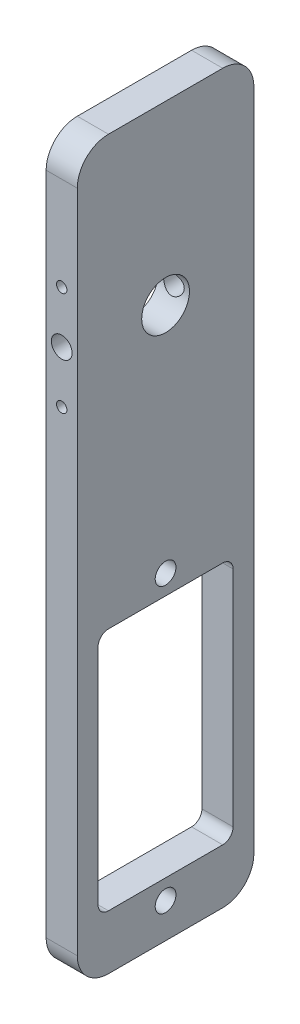
ISO-10303-21;
HEADER;
FILE_DESCRIPTION(('STEP AP214'),'2;1');
FILE_NAME('part.step','',(''),(''),'','','');
FILE_SCHEMA(('AUTOMOTIVE_DESIGN { 1 0 10303 214 1 1 1 1 }'));
ENDSEC;
DATA;
#1=APPLICATION_CONTEXT('core data for automotive mechanical design processes');
#2=APPLICATION_PROTOCOL_DEFINITION('international standard','automotive_design',2000,#1);
#3=PRODUCT_CONTEXT('',#1,'mechanical');
#4=PRODUCT('Part','Part','',(#3));
#5=PRODUCT_RELATED_PRODUCT_CATEGORY('part','',(#4));
#6=PRODUCT_DEFINITION_FORMATION('','',#4);
#7=PRODUCT_DEFINITION_CONTEXT('part definition',#1,'design');
#8=PRODUCT_DEFINITION('design','',#6,#7);
#9=PRODUCT_DEFINITION_SHAPE('','',#8);
#10=(LENGTH_UNIT() NAMED_UNIT(*) SI_UNIT(.MILLI.,.METRE.));
#11=(NAMED_UNIT(*) PLANE_ANGLE_UNIT() SI_UNIT($,.RADIAN.));
#12=(NAMED_UNIT(*) SI_UNIT($,.STERADIAN.) SOLID_ANGLE_UNIT());
#13=UNCERTAINTY_MEASURE_WITH_UNIT(LENGTH_MEASURE(1.E-05),#10,'distance_accuracy_value','');
#14=(GEOMETRIC_REPRESENTATION_CONTEXT(3) GLOBAL_UNCERTAINTY_ASSIGNED_CONTEXT((#13)) GLOBAL_UNIT_ASSIGNED_CONTEXT((#10,
#11,#12)) REPRESENTATION_CONTEXT('',''));
#15=CARTESIAN_POINT('',(0.,0.,0.));
#16=DIRECTION('',(0.,0.,1.));
#17=DIRECTION('',(1.,0.,0.));
#18=AXIS2_PLACEMENT_3D('',#15,#16,#17);
#19=CARTESIAN_POINT('',(3.,67.,5.5));
#20=DIRECTION('',(-1.,0.,0.));
#21=DIRECTION('',(0.,0.,1.));
#22=AXIS2_PLACEMENT_3D('',#19,#20,#21);
#23=PLANE('',#22);
#24=CARTESIAN_POINT('',(3.,6.25,5.5));
#25=DIRECTION('',(1.,0.,0.));
#26=DIRECTION('',(0.,0.,-1.));
#27=AXIS2_PLACEMENT_3D('',#24,#25,#26);
#28=CIRCLE('',#27,1.);
#29=CARTESIAN_POINT('',(3.,6.25,6.5));
#30=VERTEX_POINT('',#29);
#31=CARTESIAN_POINT('',(3.,5.25,5.5));
#32=VERTEX_POINT('',#31);
#33=EDGE_CURVE('E154',#30,#32,#28,.T.);
#34=ORIENTED_EDGE('',*,*,#33,.F.);
#35=DIRECTION('',(0.,-1.,0.));
#36=VECTOR('',#35,1.);
#37=CARTESIAN_POINT('',(3.,27.75,6.5));
#38=LINE('',#37,#36);
#39=CARTESIAN_POINT('',(3.,27.75,6.5));
#40=VERTEX_POINT('',#39);
#41=EDGE_CURVE('E189',#40,#30,#38,.T.);
#42=ORIENTED_EDGE('',*,*,#41,.F.);
#43=CARTESIAN_POINT('',(3.,27.75,5.5));
#44=DIRECTION('',(1.,0.,0.));
#45=DIRECTION('',(0.,0.,-1.));
#46=AXIS2_PLACEMENT_3D('',#43,#44,#45);
#47=CIRCLE('',#46,1.);
#48=CARTESIAN_POINT('',(3.,28.75,5.5));
#49=VERTEX_POINT('',#48);
#50=EDGE_CURVE('E187',#49,#40,#47,.T.);
#51=ORIENTED_EDGE('',*,*,#50,.F.);
#52=DIRECTION('',(0.,0.,1.));
#53=VECTOR('',#52,1.);
#54=CARTESIAN_POINT('',(3.,28.75,5.5));
#55=LINE('',#54,#53);
#56=CARTESIAN_POINT('',(3.,28.75,-5.5));
#57=VERTEX_POINT('',#56);
#58=EDGE_CURVE('E185',#57,#49,#55,.T.);
#59=ORIENTED_EDGE('',*,*,#58,.F.);
#60=CARTESIAN_POINT('',(3.,27.75,-5.5));
#61=DIRECTION('',(1.,0.,0.));
#62=DIRECTION('',(0.,0.,1.));
#63=AXIS2_PLACEMENT_3D('',#60,#61,#62);
#64=CIRCLE('',#63,1.);
#65=CARTESIAN_POINT('',(3.,27.75,-6.5));
#66=VERTEX_POINT('',#65);
#67=EDGE_CURVE('E183',#66,#57,#64,.T.);
#68=ORIENTED_EDGE('',*,*,#67,.F.);
#69=DIRECTION('',(0.,1.,0.));
#70=VECTOR('',#69,1.);
#71=CARTESIAN_POINT('',(3.,27.75,-6.5));
#72=LINE('',#71,#70);
#73=CARTESIAN_POINT('',(3.,6.25,-6.5));
#74=VERTEX_POINT('',#73);
#75=EDGE_CURVE('E178',#74,#66,#72,.T.);
#76=ORIENTED_EDGE('',*,*,#75,.F.);
#77=CARTESIAN_POINT('',(3.,6.25,-5.5));
#78=DIRECTION('',(1.,0.,0.));
#79=DIRECTION('',(0.,0.,-1.));
#80=AXIS2_PLACEMENT_3D('',#77,#78,#79);
#81=CIRCLE('',#80,1.);
#82=CARTESIAN_POINT('',(3.,5.25,-5.5));
#83=VERTEX_POINT('',#82);
#84=EDGE_CURVE('E176',#83,#74,#81,.T.);
#85=ORIENTED_EDGE('',*,*,#84,.F.);
#86=DIRECTION('',(0.,0.,-1.));
#87=VECTOR('',#86,1.);
#88=CARTESIAN_POINT('',(3.,5.25,5.5));
#89=LINE('',#88,#87);
#90=EDGE_CURVE('E162',#32,#83,#89,.T.);
#91=ORIENTED_EDGE('',*,*,#90,.F.);
#92=EDGE_LOOP('',(#34,#42,#51,#59,#68,#76,#85,#91));
#93=FACE_BOUND('',#92,.T.);
#94=CARTESIAN_POINT('',(3.,3.35,0.));
#95=DIRECTION('',(1.,0.,0.));
#96=DIRECTION('',(0.,0.,-1.));
#97=AXIS2_PLACEMENT_3D('',#94,#95,#96);
#98=CIRCLE('',#97,1.);
#99=CARTESIAN_POINT('',(3.,3.35,-1.));
#100=VERTEX_POINT('',#99);
#101=EDGE_CURVE('E228',#100,#100,#98,.T.);
#102=ORIENTED_EDGE('',*,*,#101,.F.);
#103=EDGE_LOOP('',(#102));
#104=FACE_BOUND('',#103,.T.);
#105=CARTESIAN_POINT('',(3.,67.,5.5));
#106=DIRECTION('',(1.,0.,0.));
#107=DIRECTION('',(0.,0.,1.));
#108=AXIS2_PLACEMENT_3D('',#105,#106,#107);
#109=CIRCLE('',#108,3.);
#110=CARTESIAN_POINT('',(3.,70.,5.5));
#111=VERTEX_POINT('',#110);
#112=CARTESIAN_POINT('',(3.,67.,8.5));
#113=VERTEX_POINT('',#112);
#114=EDGE_CURVE('E234',#111,#113,#109,.T.);
#115=ORIENTED_EDGE('',*,*,#114,.T.);
#116=DIRECTION('',(0.,-1.,0.));
#117=VECTOR('',#116,1.);
#118=CARTESIAN_POINT('',(3.,3.00000000000002,8.5));
#119=LINE('',#118,#117);
#120=CARTESIAN_POINT('',(3.,3.00000000000002,8.5));
#121=VERTEX_POINT('',#120);
#122=EDGE_CURVE('E237',#113,#121,#119,.T.);
#123=ORIENTED_EDGE('',*,*,#122,.T.);
#124=CARTESIAN_POINT('',(3.,3.,5.5));
#125=DIRECTION('',(1.,0.,0.));
#126=DIRECTION('',(0.,0.,-1.));
#127=AXIS2_PLACEMENT_3D('',#124,#125,#126);
#128=CIRCLE('',#127,3.);
#129=CARTESIAN_POINT('',(3.,0.,5.49999999999998));
#130=VERTEX_POINT('',#129);
#131=EDGE_CURVE('E240',#121,#130,#128,.T.);
#132=ORIENTED_EDGE('',*,*,#131,.T.);
#133=DIRECTION('',(0.,0.,-1.));
#134=VECTOR('',#133,1.);
#135=CARTESIAN_POINT('',(3.,0.,5.49999999999998));
#136=LINE('',#135,#134);
#137=CARTESIAN_POINT('',(3.,0.,-5.49999999999998));
#138=VERTEX_POINT('',#137);
#139=EDGE_CURVE('E242',#130,#138,#136,.T.);
#140=ORIENTED_EDGE('',*,*,#139,.T.);
#141=CARTESIAN_POINT('',(3.,3.,-5.5));
#142=DIRECTION('',(1.,0.,0.));
#143=DIRECTION('',(0.,0.,-1.));
#144=AXIS2_PLACEMENT_3D('',#141,#142,#143);
#145=CIRCLE('',#144,3.);
#146=CARTESIAN_POINT('',(3.,3.00000000000002,-8.5));
#147=VERTEX_POINT('',#146);
#148=EDGE_CURVE('E244',#138,#147,#145,.T.);
#149=ORIENTED_EDGE('',*,*,#148,.T.);
#150=DIRECTION('',(0.,1.,0.));
#151=VECTOR('',#150,1.);
#152=CARTESIAN_POINT('',(3.,3.00000000000002,-8.5));
#153=LINE('',#152,#151);
#154=CARTESIAN_POINT('',(3.,67.,-8.5));
#155=VERTEX_POINT('',#154);
#156=EDGE_CURVE('E246',#147,#155,#153,.T.);
#157=ORIENTED_EDGE('',*,*,#156,.T.);
#158=CARTESIAN_POINT('',(3.,67.,-5.5));
#159=DIRECTION('',(1.,0.,0.));
#160=DIRECTION('',(0.,0.,1.));
#161=AXIS2_PLACEMENT_3D('',#158,#159,#160);
#162=CIRCLE('',#161,3.);
#163=CARTESIAN_POINT('',(3.,70.,-5.5));
#164=VERTEX_POINT('',#163);
#165=EDGE_CURVE('E248',#155,#164,#162,.T.);
#166=ORIENTED_EDGE('',*,*,#165,.T.);
#167=DIRECTION('',(0.,0.,1.));
#168=VECTOR('',#167,1.);
#169=CARTESIAN_POINT('',(3.,70.,5.5));
#170=LINE('',#169,#168);
#171=EDGE_CURVE('E250',#164,#111,#170,.T.);
#172=ORIENTED_EDGE('',*,*,#171,.T.);
#173=EDGE_LOOP('',(#115,#123,#132,#140,#149,#157,#166,#172));
#174=FACE_BOUND('',#173,.T.);
#175=CARTESIAN_POINT('',(3.,30.65,0.));
#176=DIRECTION('',(1.,0.,0.));
#177=DIRECTION('',(0.,0.,1.));
#178=AXIS2_PLACEMENT_3D('',#175,#176,#177);
#179=CIRCLE('',#178,1.);
#180=CARTESIAN_POINT('',(3.,30.65,1.));
#181=VERTEX_POINT('',#180);
#182=EDGE_CURVE('E222',#181,#181,#179,.T.);
#183=ORIENTED_EDGE('',*,*,#182,.F.);
#184=EDGE_LOOP('',(#183));
#185=FACE_BOUND('',#184,.T.);
#186=CARTESIAN_POINT('',(3.,53.,0.));
#187=DIRECTION('',(1.,0.,0.));
#188=DIRECTION('',(0.,0.,1.));
#189=AXIS2_PLACEMENT_3D('',#186,#187,#188);
#190=CIRCLE('',#189,2.3);
#191=CARTESIAN_POINT('',(3.,53.,2.3));
#192=VERTEX_POINT('',#191);
#193=EDGE_CURVE('E192',#192,#192,#190,.T.);
#194=ORIENTED_EDGE('',*,*,#193,.F.);
#195=EDGE_LOOP('',(#194));
#196=FACE_BOUND('',#195,.T.);
#197=ADVANCED_FACE('F35',(#93,#104,#174,#185,#196),#23,.F.);
#198=CARTESIAN_POINT('',(0.,67.,5.5));
#199=DIRECTION('',(-1.,0.,0.));
#200=DIRECTION('',(0.,0.,1.));
#201=AXIS2_PLACEMENT_3D('',#198,#199,#200);
#202=PLANE('',#201);
#203=DIRECTION('',(0.,-1.,0.));
#204=VECTOR('',#203,1.);
#205=CARTESIAN_POINT('',(0.,27.75,6.5));
#206=LINE('',#205,#204);
#207=CARTESIAN_POINT('',(0.,27.75,6.5));
#208=VERTEX_POINT('',#207);
#209=CARTESIAN_POINT('',(0.,6.25000000000001,6.5));
#210=VERTEX_POINT('',#209);
#211=EDGE_CURVE('E163',#208,#210,#206,.T.);
#212=ORIENTED_EDGE('',*,*,#211,.T.);
#213=CARTESIAN_POINT('',(0.,6.25,5.5));
#214=DIRECTION('',(1.,0.,0.));
#215=DIRECTION('',(0.,0.,-1.));
#216=AXIS2_PLACEMENT_3D('',#213,#214,#215);
#217=CIRCLE('',#216,1.);
#218=CARTESIAN_POINT('',(0.,5.25,5.5));
#219=VERTEX_POINT('',#218);
#220=EDGE_CURVE('E64',#210,#219,#217,.T.);
#221=ORIENTED_EDGE('',*,*,#220,.T.);
#222=DIRECTION('',(0.,0.,-1.));
#223=VECTOR('',#222,1.);
#224=CARTESIAN_POINT('',(0.,5.25,5.5));
#225=LINE('',#224,#223);
#226=CARTESIAN_POINT('',(0.,5.25,-5.5));
#227=VERTEX_POINT('',#226);
#228=EDGE_CURVE('E169',#219,#227,#225,.T.);
#229=ORIENTED_EDGE('',*,*,#228,.T.);
#230=CARTESIAN_POINT('',(0.,6.25,-5.5));
#231=DIRECTION('',(1.,0.,0.));
#232=DIRECTION('',(0.,0.,-1.));
#233=AXIS2_PLACEMENT_3D('',#230,#231,#232);
#234=CIRCLE('',#233,1.);
#235=CARTESIAN_POINT('',(0.,6.25,-6.5));
#236=VERTEX_POINT('',#235);
#237=EDGE_CURVE('E194',#227,#236,#234,.T.);
#238=ORIENTED_EDGE('',*,*,#237,.T.);
#239=DIRECTION('',(0.,1.,0.));
#240=VECTOR('',#239,1.);
#241=CARTESIAN_POINT('',(0.,27.75,-6.5));
#242=LINE('',#241,#240);
#243=CARTESIAN_POINT('',(0.,27.75,-6.5));
#244=VERTEX_POINT('',#243);
#245=EDGE_CURVE('E197',#236,#244,#242,.T.);
#246=ORIENTED_EDGE('',*,*,#245,.T.);
#247=CARTESIAN_POINT('',(0.,27.75,-5.5));
#248=DIRECTION('',(1.,0.,0.));
#249=DIRECTION('',(0.,0.,1.));
#250=AXIS2_PLACEMENT_3D('',#247,#248,#249);
#251=CIRCLE('',#250,1.);
#252=CARTESIAN_POINT('',(0.,28.75,-5.5));
#253=VERTEX_POINT('',#252);
#254=EDGE_CURVE('E200',#244,#253,#251,.T.);
#255=ORIENTED_EDGE('',*,*,#254,.T.);
#256=DIRECTION('',(0.,0.,1.));
#257=VECTOR('',#256,1.);
#258=CARTESIAN_POINT('',(0.,28.75,5.5));
#259=LINE('',#258,#257);
#260=CARTESIAN_POINT('',(0.,28.75,5.5));
#261=VERTEX_POINT('',#260);
#262=EDGE_CURVE('E203',#253,#261,#259,.T.);
#263=ORIENTED_EDGE('',*,*,#262,.T.);
#264=CARTESIAN_POINT('',(0.,27.75,5.5));
#265=DIRECTION('',(1.,0.,0.));
#266=DIRECTION('',(0.,0.,-1.));
#267=AXIS2_PLACEMENT_3D('',#264,#265,#266);
#268=CIRCLE('',#267,1.);
#269=EDGE_CURVE('E206',#261,#208,#268,.T.);
#270=ORIENTED_EDGE('',*,*,#269,.T.);
#271=EDGE_LOOP('',(#212,#221,#229,#238,#246,#255,#263,#270));
#272=FACE_BOUND('',#271,.T.);
#273=CARTESIAN_POINT('',(0.,3.35,0.));
#274=DIRECTION('',(1.,0.,0.));
#275=DIRECTION('',(0.,0.,-1.));
#276=AXIS2_PLACEMENT_3D('',#273,#274,#275);
#277=CIRCLE('',#276,1.);
#278=CARTESIAN_POINT('',(0.,3.35,-1.));
#279=VERTEX_POINT('',#278);
#280=EDGE_CURVE('E225',#279,#279,#277,.T.);
#281=ORIENTED_EDGE('',*,*,#280,.T.);
#282=EDGE_LOOP('',(#281));
#283=FACE_BOUND('',#282,.T.);
#284=CARTESIAN_POINT('',(0.,67.,5.5));
#285=DIRECTION('',(1.,0.,0.));
#286=DIRECTION('',(0.,0.,1.));
#287=AXIS2_PLACEMENT_3D('',#284,#285,#286);
#288=CIRCLE('',#287,3.);
#289=CARTESIAN_POINT('',(0.,70.,5.5));
#290=VERTEX_POINT('',#289);
#291=CARTESIAN_POINT('',(0.,67.,8.5));
#292=VERTEX_POINT('',#291);
#293=EDGE_CURVE('E231',#290,#292,#288,.T.);
#294=ORIENTED_EDGE('',*,*,#293,.F.);
#295=DIRECTION('',(0.,0.,1.));
#296=VECTOR('',#295,1.);
#297=CARTESIAN_POINT('',(0.,70.,5.5));
#298=LINE('',#297,#296);
#299=CARTESIAN_POINT('',(0.,70.,-5.5));
#300=VERTEX_POINT('',#299);
#301=EDGE_CURVE('E238',#300,#290,#298,.T.);
#302=ORIENTED_EDGE('',*,*,#301,.F.);
#303=CARTESIAN_POINT('',(0.,67.,-5.5));
#304=DIRECTION('',(1.,0.,0.));
#305=DIRECTION('',(0.,0.,1.));
#306=AXIS2_PLACEMENT_3D('',#303,#304,#305);
#307=CIRCLE('',#306,3.);
#308=CARTESIAN_POINT('',(0.,67.,-8.5));
#309=VERTEX_POINT('',#308);
#310=EDGE_CURVE('E265',#309,#300,#307,.T.);
#311=ORIENTED_EDGE('',*,*,#310,.F.);
#312=DIRECTION('',(0.,1.,0.));
#313=VECTOR('',#312,1.);
#314=CARTESIAN_POINT('',(0.,3.00000000000002,-8.5));
#315=LINE('',#314,#313);
#316=CARTESIAN_POINT('',(0.,3.00000000000002,-8.5));
#317=VERTEX_POINT('',#316);
#318=EDGE_CURVE('E263',#317,#309,#315,.T.);
#319=ORIENTED_EDGE('',*,*,#318,.F.);
#320=CARTESIAN_POINT('',(0.,3.,-5.5));
#321=DIRECTION('',(1.,0.,0.));
#322=DIRECTION('',(0.,0.,-1.));
#323=AXIS2_PLACEMENT_3D('',#320,#321,#322);
#324=CIRCLE('',#323,3.);
#325=CARTESIAN_POINT('',(0.,0.,-5.49999999999998));
#326=VERTEX_POINT('',#325);
#327=EDGE_CURVE('E261',#326,#317,#324,.T.);
#328=ORIENTED_EDGE('',*,*,#327,.F.);
#329=DIRECTION('',(0.,0.,-1.));
#330=VECTOR('',#329,1.);
#331=CARTESIAN_POINT('',(0.,0.,5.49999999999998));
#332=LINE('',#331,#330);
#333=CARTESIAN_POINT('',(0.,0.,5.49999999999998));
#334=VERTEX_POINT('',#333);
#335=EDGE_CURVE('E259',#334,#326,#332,.T.);
#336=ORIENTED_EDGE('',*,*,#335,.F.);
#337=CARTESIAN_POINT('',(0.,3.,5.5));
#338=DIRECTION('',(1.,0.,0.));
#339=DIRECTION('',(0.,0.,-1.));
#340=AXIS2_PLACEMENT_3D('',#337,#338,#339);
#341=CIRCLE('',#340,3.);
#342=CARTESIAN_POINT('',(0.,3.00000000000002,8.5));
#343=VERTEX_POINT('',#342);
#344=EDGE_CURVE('E257',#343,#334,#341,.T.);
#345=ORIENTED_EDGE('',*,*,#344,.F.);
#346=DIRECTION('',(0.,-1.,0.));
#347=VECTOR('',#346,1.);
#348=CARTESIAN_POINT('',(0.,3.00000000000002,8.5));
#349=LINE('',#348,#347);
#350=EDGE_CURVE('E255',#292,#343,#349,.T.);
#351=ORIENTED_EDGE('',*,*,#350,.F.);
#352=EDGE_LOOP('',(#294,#302,#311,#319,#328,#336,#345,#351));
#353=FACE_BOUND('',#352,.T.);
#354=CARTESIAN_POINT('',(0.,30.65,0.));
#355=DIRECTION('',(1.,0.,0.));
#356=DIRECTION('',(0.,0.,1.));
#357=AXIS2_PLACEMENT_3D('',#354,#355,#356);
#358=CIRCLE('',#357,1.);
#359=CARTESIAN_POINT('',(0.,30.65,1.));
#360=VERTEX_POINT('',#359);
#361=EDGE_CURVE('E170',#360,#360,#358,.T.);
#362=ORIENTED_EDGE('',*,*,#361,.T.);
#363=EDGE_LOOP('',(#362));
#364=FACE_BOUND('',#363,.T.);
#365=CARTESIAN_POINT('',(0.,53.,0.));
#366=DIRECTION('',(1.,0.,0.));
#367=DIRECTION('',(0.,0.,1.));
#368=AXIS2_PLACEMENT_3D('',#365,#366,#367);
#369=CIRCLE('',#368,2.3);
#370=CARTESIAN_POINT('',(0.,53.,2.3));
#371=VERTEX_POINT('',#370);
#372=EDGE_CURVE('E399',#371,#371,#369,.T.);
#373=ORIENTED_EDGE('',*,*,#372,.T.);
#374=EDGE_LOOP('',(#373));
#375=FACE_BOUND('',#374,.T.);
#376=ADVANCED_FACE('F316',(#272,#283,#353,#364,#375),#202,.T.);
#377=CARTESIAN_POINT('',(3.,67.,5.5));
#378=DIRECTION('',(-1.,0.,0.));
#379=DIRECTION('',(0.,0.,1.));
#380=AXIS2_PLACEMENT_3D('',#377,#378,#379);
#381=CYLINDRICAL_SURFACE('',#380,3.);
#382=ORIENTED_EDGE('',*,*,#293,.T.);
#383=DIRECTION('',(-1.,0.,0.));
#384=VECTOR('',#383,1.);
#385=CARTESIAN_POINT('',(3.,67.,8.5));
#386=LINE('',#385,#384);
#387=EDGE_CURVE('E11',#113,#292,#386,.T.);
#388=ORIENTED_EDGE('',*,*,#387,.F.);
#389=ORIENTED_EDGE('',*,*,#114,.F.);
#390=DIRECTION('',(-1.,0.,0.));
#391=VECTOR('',#390,1.);
#392=CARTESIAN_POINT('',(3.,70.,5.5));
#393=LINE('',#392,#391);
#394=EDGE_CURVE('E252',#111,#290,#393,.T.);
#395=ORIENTED_EDGE('',*,*,#394,.T.);
#396=EDGE_LOOP('',(#382,#388,#389,#395));
#397=FACE_BOUND('',#396,.T.);
#398=ADVANCED_FACE('F37',(#397),#381,.T.);
#399=CARTESIAN_POINT('',(3.,3.00000000000002,8.5));
#400=DIRECTION('',(0.,0.,-1.));
#401=DIRECTION('',(-1.,0.,0.));
#402=AXIS2_PLACEMENT_3D('',#399,#400,#401);
#403=PLANE('',#402);
#404=CARTESIAN_POINT('',(1.5,53.,8.5));
#405=DIRECTION('',(0.,0.,-1.));
#406=DIRECTION('',(-1.,0.,0.));
#407=AXIS2_PLACEMENT_3D('',#404,#405,#406);
#408=CIRCLE('',#407,1.);
#409=CARTESIAN_POINT('',(0.499999999999998,53.,8.5));
#410=VERTEX_POINT('',#409);
#411=EDGE_CURVE('E290',#410,#410,#408,.T.);
#412=ORIENTED_EDGE('',*,*,#411,.T.);
#413=EDGE_LOOP('',(#412));
#414=FACE_BOUND('',#413,.T.);
#415=CARTESIAN_POINT('',(1.50000000000001,48.,8.5));
#416=DIRECTION('',(0.,0.,-1.));
#417=DIRECTION('',(1.,0.,0.));
#418=AXIS2_PLACEMENT_3D('',#415,#416,#417);
#419=CIRCLE('',#418,0.5);
#420=CARTESIAN_POINT('',(2.00000000000001,48.,8.5));
#421=VERTEX_POINT('',#420);
#422=EDGE_CURVE('E363',#421,#421,#419,.T.);
#423=ORIENTED_EDGE('',*,*,#422,.T.);
#424=EDGE_LOOP('',(#423));
#425=FACE_BOUND('',#424,.T.);
#426=CARTESIAN_POINT('',(1.50000000000001,58.,8.5));
#427=DIRECTION('',(0.,0.,-1.));
#428=DIRECTION('',(-1.,0.,0.));
#429=AXIS2_PLACEMENT_3D('',#426,#427,#428);
#430=CIRCLE('',#429,0.5);
#431=CARTESIAN_POINT('',(1.00000000000001,58.,8.5));
#432=VERTEX_POINT('',#431);
#433=EDGE_CURVE('E366',#432,#432,#430,.T.);
#434=ORIENTED_EDGE('',*,*,#433,.T.);
#435=EDGE_LOOP('',(#434));
#436=FACE_BOUND('',#435,.T.);
#437=ORIENTED_EDGE('',*,*,#350,.T.);
#438=DIRECTION('',(-1.,0.,0.));
#439=VECTOR('',#438,1.);
#440=CARTESIAN_POINT('',(3.,3.00000000000002,8.5));
#441=LINE('',#440,#439);
#442=EDGE_CURVE('E48',#121,#343,#441,.T.);
#443=ORIENTED_EDGE('',*,*,#442,.F.);
#444=ORIENTED_EDGE('',*,*,#122,.F.);
#445=ORIENTED_EDGE('',*,*,#387,.T.);
#446=EDGE_LOOP('',(#437,#443,#444,#445));
#447=FACE_BOUND('',#446,.T.);
#448=ADVANCED_FACE('F349',(#414,#425,#436,#447),#403,.F.);
#449=CARTESIAN_POINT('',(3.,3.,5.5));
#450=DIRECTION('',(-1.,0.,0.));
#451=DIRECTION('',(0.,0.,1.));
#452=AXIS2_PLACEMENT_3D('',#449,#450,#451);
#453=CYLINDRICAL_SURFACE('',#452,3.);
#454=ORIENTED_EDGE('',*,*,#344,.T.);
#455=DIRECTION('',(-1.,0.,0.));
#456=VECTOR('',#455,1.);
#457=CARTESIAN_POINT('',(3.,0.,5.49999999999998));
#458=LINE('',#457,#456);
#459=EDGE_CURVE('E282',#130,#334,#458,.T.);
#460=ORIENTED_EDGE('',*,*,#459,.F.);
#461=ORIENTED_EDGE('',*,*,#131,.F.);
#462=ORIENTED_EDGE('',*,*,#442,.T.);
#463=EDGE_LOOP('',(#454,#460,#461,#462));
#464=FACE_BOUND('',#463,.T.);
#465=ADVANCED_FACE('F346',(#464),#453,.T.);
#466=CARTESIAN_POINT('',(3.,0.,5.49999999999998));
#467=DIRECTION('',(0.,1.,0.));
#468=DIRECTION('',(0.,0.,1.));
#469=AXIS2_PLACEMENT_3D('',#466,#467,#468);
#470=PLANE('',#469);
#471=ORIENTED_EDGE('',*,*,#335,.T.);
#472=DIRECTION('',(-1.,0.,0.));
#473=VECTOR('',#472,1.);
#474=CARTESIAN_POINT('',(3.,0.,-5.49999999999998));
#475=LINE('',#474,#473);
#476=EDGE_CURVE('E279',#138,#326,#475,.T.);
#477=ORIENTED_EDGE('',*,*,#476,.F.);
#478=ORIENTED_EDGE('',*,*,#139,.F.);
#479=ORIENTED_EDGE('',*,*,#459,.T.);
#480=EDGE_LOOP('',(#471,#477,#478,#479));
#481=FACE_BOUND('',#480,.T.);
#482=ADVANCED_FACE('F342',(#481),#470,.F.);
#483=CARTESIAN_POINT('',(3.,3.,-5.5));
#484=DIRECTION('',(-1.,0.,0.));
#485=DIRECTION('',(0.,0.,1.));
#486=AXIS2_PLACEMENT_3D('',#483,#484,#485);
#487=CYLINDRICAL_SURFACE('',#486,3.);
#488=ORIENTED_EDGE('',*,*,#327,.T.);
#489=DIRECTION('',(-1.,0.,0.));
#490=VECTOR('',#489,1.);
#491=CARTESIAN_POINT('',(3.,3.00000000000002,-8.5));
#492=LINE('',#491,#490);
#493=EDGE_CURVE('E276',#147,#317,#492,.T.);
#494=ORIENTED_EDGE('',*,*,#493,.F.);
#495=ORIENTED_EDGE('',*,*,#148,.F.);
#496=ORIENTED_EDGE('',*,*,#476,.T.);
#497=EDGE_LOOP('',(#488,#494,#495,#496));
#498=FACE_BOUND('',#497,.T.);
#499=ADVANCED_FACE('F338',(#498),#487,.T.);
#500=CARTESIAN_POINT('',(3.,3.00000000000002,-8.5));
#501=DIRECTION('',(0.,0.,1.));
#502=DIRECTION('',(1.,0.,0.));
#503=AXIS2_PLACEMENT_3D('',#500,#501,#502);
#504=PLANE('',#503);
#505=CARTESIAN_POINT('',(1.5,53.,-8.5));
#506=DIRECTION('',(0.,0.,-1.));
#507=DIRECTION('',(-1.,0.,0.));
#508=AXIS2_PLACEMENT_3D('',#505,#506,#507);
#509=CIRCLE('',#508,1.);
#510=CARTESIAN_POINT('',(0.499999999999998,53.,-8.5));
#511=VERTEX_POINT('',#510);
#512=EDGE_CURVE('E411',#511,#511,#509,.T.);
#513=ORIENTED_EDGE('',*,*,#512,.F.);
#514=EDGE_LOOP('',(#513));
#515=FACE_BOUND('',#514,.T.);
#516=CARTESIAN_POINT('',(1.50000000000001,48.,-8.5));
#517=DIRECTION('',(0.,0.,-1.));
#518=DIRECTION('',(1.,0.,0.));
#519=AXIS2_PLACEMENT_3D('',#516,#517,#518);
#520=CIRCLE('',#519,0.5);
#521=CARTESIAN_POINT('',(2.00000000000001,48.,-8.5));
#522=VERTEX_POINT('',#521);
#523=EDGE_CURVE('E407',#522,#522,#520,.T.);
#524=ORIENTED_EDGE('',*,*,#523,.F.);
#525=EDGE_LOOP('',(#524));
#526=FACE_BOUND('',#525,.T.);
#527=CARTESIAN_POINT('',(1.50000000000001,58.,-8.5));
#528=DIRECTION('',(0.,0.,-1.));
#529=DIRECTION('',(-1.,0.,0.));
#530=AXIS2_PLACEMENT_3D('',#527,#528,#529);
#531=CIRCLE('',#530,0.5);
#532=CARTESIAN_POINT('',(1.00000000000001,58.,-8.5));
#533=VERTEX_POINT('',#532);
#534=EDGE_CURVE('E403',#533,#533,#531,.T.);
#535=ORIENTED_EDGE('',*,*,#534,.F.);
#536=EDGE_LOOP('',(#535));
#537=FACE_BOUND('',#536,.T.);
#538=ORIENTED_EDGE('',*,*,#318,.T.);
#539=DIRECTION('',(-1.,0.,0.));
#540=VECTOR('',#539,1.);
#541=CARTESIAN_POINT('',(3.,67.,-8.5));
#542=LINE('',#541,#540);
#543=EDGE_CURVE('E273',#155,#309,#542,.T.);
#544=ORIENTED_EDGE('',*,*,#543,.F.);
#545=ORIENTED_EDGE('',*,*,#156,.F.);
#546=ORIENTED_EDGE('',*,*,#493,.T.);
#547=EDGE_LOOP('',(#538,#544,#545,#546));
#548=FACE_BOUND('',#547,.T.);
#549=ADVANCED_FACE('F334',(#515,#526,#537,#548),#504,.F.);
#550=CARTESIAN_POINT('',(3.,67.,-5.5));
#551=DIRECTION('',(-1.,0.,0.));
#552=DIRECTION('',(0.,0.,1.));
#553=AXIS2_PLACEMENT_3D('',#550,#551,#552);
#554=CYLINDRICAL_SURFACE('',#553,3.);
#555=ORIENTED_EDGE('',*,*,#310,.T.);
#556=DIRECTION('',(-1.,0.,0.));
#557=VECTOR('',#556,1.);
#558=CARTESIAN_POINT('',(3.,70.,-5.5));
#559=LINE('',#558,#557);
#560=EDGE_CURVE('E270',#164,#300,#559,.T.);
#561=ORIENTED_EDGE('',*,*,#560,.F.);
#562=ORIENTED_EDGE('',*,*,#165,.F.);
#563=ORIENTED_EDGE('',*,*,#543,.T.);
#564=EDGE_LOOP('',(#555,#561,#562,#563));
#565=FACE_BOUND('',#564,.T.);
#566=ADVANCED_FACE('F330',(#565),#554,.T.);
#567=CARTESIAN_POINT('',(3.,70.,5.5));
#568=DIRECTION('',(0.,-1.,0.));
#569=DIRECTION('',(0.,0.,-1.));
#570=AXIS2_PLACEMENT_3D('',#567,#568,#569);
#571=PLANE('',#570);
#572=ORIENTED_EDGE('',*,*,#301,.T.);
#573=ORIENTED_EDGE('',*,*,#394,.F.);
#574=ORIENTED_EDGE('',*,*,#171,.F.);
#575=ORIENTED_EDGE('',*,*,#560,.T.);
#576=EDGE_LOOP('',(#572,#573,#574,#575));
#577=FACE_BOUND('',#576,.T.);
#578=ADVANCED_FACE('F327',(#577),#571,.F.);
#579=CARTESIAN_POINT('',(3.,3.35,0.));
#580=DIRECTION('',(-1.,0.,0.));
#581=DIRECTION('',(0.,0.,1.));
#582=AXIS2_PLACEMENT_3D('',#579,#580,#581);
#583=CYLINDRICAL_SURFACE('',#582,1.);
#584=ORIENTED_EDGE('',*,*,#101,.T.);
#585=EDGE_LOOP('',(#584));
#586=FACE_BOUND('',#585,.T.);
#587=ORIENTED_EDGE('',*,*,#280,.F.);
#588=EDGE_LOOP('',(#587));
#589=FACE_BOUND('',#588,.T.);
#590=ADVANCED_FACE('F324',(#586,#589),#583,.F.);
#591=CARTESIAN_POINT('',(3.,30.65,0.));
#592=DIRECTION('',(-1.,0.,0.));
#593=DIRECTION('',(0.,0.,1.));
#594=AXIS2_PLACEMENT_3D('',#591,#592,#593);
#595=CYLINDRICAL_SURFACE('',#594,1.);
#596=ORIENTED_EDGE('',*,*,#182,.T.);
#597=EDGE_LOOP('',(#596));
#598=FACE_BOUND('',#597,.T.);
#599=ORIENTED_EDGE('',*,*,#361,.F.);
#600=EDGE_LOOP('',(#599));
#601=FACE_BOUND('',#600,.T.);
#602=ADVANCED_FACE('F539',(#598,#601),#595,.F.);
#603=CARTESIAN_POINT('',(3.,6.25,5.5));
#604=DIRECTION('',(-1.,0.,0.));
#605=DIRECTION('',(0.,0.,1.));
#606=AXIS2_PLACEMENT_3D('',#603,#604,#605);
#607=CYLINDRICAL_SURFACE('',#606,1.);
#608=ORIENTED_EDGE('',*,*,#220,.F.);
#609=DIRECTION('',(-1.,0.,0.));
#610=VECTOR('',#609,1.);
#611=CARTESIAN_POINT('',(3.,6.25,6.5));
#612=LINE('',#611,#610);
#613=EDGE_CURVE('E158',#30,#210,#612,.T.);
#614=ORIENTED_EDGE('',*,*,#613,.F.);
#615=ORIENTED_EDGE('',*,*,#33,.T.);
#616=DIRECTION('',(-1.,0.,0.));
#617=VECTOR('',#616,1.);
#618=CARTESIAN_POINT('',(3.,5.25,5.5));
#619=LINE('',#618,#617);
#620=EDGE_CURVE('E157',#32,#219,#619,.T.);
#621=ORIENTED_EDGE('',*,*,#620,.T.);
#622=EDGE_LOOP('',(#608,#614,#615,#621));
#623=FACE_BOUND('',#622,.T.);
#624=ADVANCED_FACE('F156',(#623),#607,.F.);
#625=CARTESIAN_POINT('',(3.,5.25,5.5));
#626=DIRECTION('',(0.,1.,0.));
#627=DIRECTION('',(0.,0.,1.));
#628=AXIS2_PLACEMENT_3D('',#625,#626,#627);
#629=PLANE('',#628);
#630=ORIENTED_EDGE('',*,*,#228,.F.);
#631=ORIENTED_EDGE('',*,*,#620,.F.);
#632=ORIENTED_EDGE('',*,*,#90,.T.);
#633=DIRECTION('',(-1.,0.,0.));
#634=VECTOR('',#633,1.);
#635=CARTESIAN_POINT('',(3.,5.25,-5.5));
#636=LINE('',#635,#634);
#637=EDGE_CURVE('E171',#83,#227,#636,.T.);
#638=ORIENTED_EDGE('',*,*,#637,.T.);
#639=EDGE_LOOP('',(#630,#631,#632,#638));
#640=FACE_BOUND('',#639,.T.);
#641=ADVANCED_FACE('F166',(#640),#629,.T.);
#642=CARTESIAN_POINT('',(3.,6.25,-5.5));
#643=DIRECTION('',(-1.,0.,0.));
#644=DIRECTION('',(0.,0.,1.));
#645=AXIS2_PLACEMENT_3D('',#642,#643,#644);
#646=CYLINDRICAL_SURFACE('',#645,1.);
#647=ORIENTED_EDGE('',*,*,#237,.F.);
#648=ORIENTED_EDGE('',*,*,#637,.F.);
#649=ORIENTED_EDGE('',*,*,#84,.T.);
#650=DIRECTION('',(-1.,0.,0.));
#651=VECTOR('',#650,1.);
#652=CARTESIAN_POINT('',(3.,6.25,-6.5));
#653=LINE('',#652,#651);
#654=EDGE_CURVE('E219',#74,#236,#653,.T.);
#655=ORIENTED_EDGE('',*,*,#654,.T.);
#656=EDGE_LOOP('',(#647,#648,#649,#655));
#657=FACE_BOUND('',#656,.T.);
#658=ADVANCED_FACE('F512',(#657),#646,.F.);
#659=CARTESIAN_POINT('',(3.,27.75,-6.5));
#660=DIRECTION('',(0.,0.,1.));
#661=DIRECTION('',(1.,0.,0.));
#662=AXIS2_PLACEMENT_3D('',#659,#660,#661);
#663=PLANE('',#662);
#664=ORIENTED_EDGE('',*,*,#245,.F.);
#665=ORIENTED_EDGE('',*,*,#654,.F.);
#666=ORIENTED_EDGE('',*,*,#75,.T.);
#667=DIRECTION('',(-1.,0.,0.));
#668=VECTOR('',#667,1.);
#669=CARTESIAN_POINT('',(3.,27.75,-6.5));
#670=LINE('',#669,#668);
#671=EDGE_CURVE('E217',#66,#244,#670,.T.);
#672=ORIENTED_EDGE('',*,*,#671,.T.);
#673=EDGE_LOOP('',(#664,#665,#666,#672));
#674=FACE_BOUND('',#673,.T.);
#675=ADVANCED_FACE('F502',(#674),#663,.T.);
#676=CARTESIAN_POINT('',(3.,27.75,-5.5));
#677=DIRECTION('',(-1.,0.,0.));
#678=DIRECTION('',(0.,0.,1.));
#679=AXIS2_PLACEMENT_3D('',#676,#677,#678);
#680=CYLINDRICAL_SURFACE('',#679,1.);
#681=ORIENTED_EDGE('',*,*,#254,.F.);
#682=ORIENTED_EDGE('',*,*,#671,.F.);
#683=ORIENTED_EDGE('',*,*,#67,.T.);
#684=DIRECTION('',(-1.,0.,0.));
#685=VECTOR('',#684,1.);
#686=CARTESIAN_POINT('',(3.,28.75,-5.5));
#687=LINE('',#686,#685);
#688=EDGE_CURVE('E215',#57,#253,#687,.T.);
#689=ORIENTED_EDGE('',*,*,#688,.T.);
#690=EDGE_LOOP('',(#681,#682,#683,#689));
#691=FACE_BOUND('',#690,.T.);
#692=ADVANCED_FACE('F492',(#691),#680,.F.);
#693=CARTESIAN_POINT('',(3.,28.75,5.5));
#694=DIRECTION('',(0.,-1.,0.));
#695=DIRECTION('',(0.,0.,-1.));
#696=AXIS2_PLACEMENT_3D('',#693,#694,#695);
#697=PLANE('',#696);
#698=ORIENTED_EDGE('',*,*,#262,.F.);
#699=ORIENTED_EDGE('',*,*,#688,.F.);
#700=ORIENTED_EDGE('',*,*,#58,.T.);
#701=DIRECTION('',(-1.,0.,0.));
#702=VECTOR('',#701,1.);
#703=CARTESIAN_POINT('',(3.,28.75,5.5));
#704=LINE('',#703,#702);
#705=EDGE_CURVE('E213',#49,#261,#704,.T.);
#706=ORIENTED_EDGE('',*,*,#705,.T.);
#707=EDGE_LOOP('',(#698,#699,#700,#706));
#708=FACE_BOUND('',#707,.T.);
#709=ADVANCED_FACE('F482',(#708),#697,.T.);
#710=CARTESIAN_POINT('',(3.,27.75,5.5));
#711=DIRECTION('',(-1.,0.,0.));
#712=DIRECTION('',(0.,0.,1.));
#713=AXIS2_PLACEMENT_3D('',#710,#711,#712);
#714=CYLINDRICAL_SURFACE('',#713,1.);
#715=ORIENTED_EDGE('',*,*,#269,.F.);
#716=ORIENTED_EDGE('',*,*,#705,.F.);
#717=ORIENTED_EDGE('',*,*,#50,.T.);
#718=DIRECTION('',(-1.,0.,0.));
#719=VECTOR('',#718,1.);
#720=CARTESIAN_POINT('',(3.,27.75,6.5));
#721=LINE('',#720,#719);
#722=EDGE_CURVE('E56',#40,#208,#721,.T.);
#723=ORIENTED_EDGE('',*,*,#722,.T.);
#724=EDGE_LOOP('',(#715,#716,#717,#723));
#725=FACE_BOUND('',#724,.T.);
#726=ADVANCED_FACE('F474',(#725),#714,.F.);
#727=CARTESIAN_POINT('',(3.,27.75,6.5));
#728=DIRECTION('',(0.,0.,-1.));
#729=DIRECTION('',(-1.,0.,0.));
#730=AXIS2_PLACEMENT_3D('',#727,#728,#729);
#731=PLANE('',#730);
#732=ORIENTED_EDGE('',*,*,#211,.F.);
#733=ORIENTED_EDGE('',*,*,#722,.F.);
#734=ORIENTED_EDGE('',*,*,#41,.T.);
#735=ORIENTED_EDGE('',*,*,#613,.T.);
#736=EDGE_LOOP('',(#732,#733,#734,#735));
#737=FACE_BOUND('',#736,.T.);
#738=ADVANCED_FACE('F311',(#737),#731,.T.);
#739=CARTESIAN_POINT('',(3.,53.,0.));
#740=DIRECTION('',(-1.,0.,0.));
#741=DIRECTION('',(0.,0.,1.));
#742=AXIS2_PLACEMENT_3D('',#739,#740,#741);
#743=CYLINDRICAL_SURFACE('',#742,2.3);
#744=CARTESIAN_POINT('',(2.5,53.,2.3));
#745=CARTESIAN_POINT('',(2.49999372982742,52.9466348632728,2.29999520955671));
#746=CARTESIAN_POINT('',(2.49570329742934,52.8931966347626,2.2981216030008));
#747=CARTESIAN_POINT('',(2.47869912120613,52.7878438901555,2.29080691339504));
#748=CARTESIAN_POINT('',(2.46596450207667,52.7359334840611,2.2853569894959));
#749=CARTESIAN_POINT('',(2.43263990740964,52.6353365749961,2.27147290602193));
#750=CARTESIAN_POINT('',(2.41207747665526,52.5866394620702,2.26304921810166));
#751=CARTESIAN_POINT('',(2.36379986147408,52.4934368026828,2.2440274752431));
#752=CARTESIAN_POINT('',(2.33608649481236,52.4489301949149,2.23342997302771));
#753=CARTESIAN_POINT('',(2.27272657393635,52.3629085990637,2.21047344021705));
#754=CARTESIAN_POINT('',(2.23675740001118,52.321647672003,2.19805347933505));
#755=CARTESIAN_POINT('',(2.15859074742637,52.2455217204542,2.17310156866541));
#756=CARTESIAN_POINT('',(2.11638973803867,52.2106603469981,2.16056955920142));
#757=CARTESIAN_POINT('',(2.02416646115379,52.1464335939084,2.13604110689336));
#758=CARTESIAN_POINT('',(1.97384274461108,52.1174728499117,2.1241113942764));
#759=CARTESIAN_POINT('',(1.8684472766672,52.0685405114515,2.10311612138188));
#760=CARTESIAN_POINT('',(1.81337820389602,52.0485638847845,2.09404895857699));
#761=CARTESIAN_POINT('',(1.70297872821017,52.0192392773453,2.0804708662989));
#762=CARTESIAN_POINT('',(1.64780553932111,52.0094002438827,2.07575075065996));
#763=CARTESIAN_POINT('',(1.53640511477157,51.9991012147292,2.07080608063601));
#764=CARTESIAN_POINT('',(1.48017855960978,51.9986353595865,2.07057871769964));
#765=CARTESIAN_POINT('',(1.37336931876714,52.0067284365769,2.07446983286886));
#766=CARTESIAN_POINT('',(1.32271267404937,52.0145246965883,2.07822107188989));
#767=CARTESIAN_POINT('',(1.22351459235433,52.0376328285944,2.08902138562733));
#768=CARTESIAN_POINT('',(1.17497360700458,52.0529462968067,2.096071160746));
#769=CARTESIAN_POINT('',(1.08010623189208,52.0909569200751,2.11283663204231));
#770=CARTESIAN_POINT('',(1.03385243156041,52.1138096814575,2.12260776893169));
#771=CARTESIAN_POINT('',(0.945645955508396,52.1661390228219,2.1437048706901));
#772=CARTESIAN_POINT('',(0.90369506446324,52.1956183351841,2.15503147618658));
#773=CARTESIAN_POINT('',(0.821187344692419,52.2635710226914,2.17924035952452));
#774=CARTESIAN_POINT('',(0.7811211415098,52.30262516891,2.19216946190512));
#775=CARTESIAN_POINT('',(0.707933823302533,52.3870141551803,2.21724715469593));
#776=CARTESIAN_POINT('',(0.674814633698281,52.4323507306909,2.22939552807545));
#777=CARTESIAN_POINT('',(0.615652893383951,52.5296218509798,2.25195478869035));
#778=CARTESIAN_POINT('',(0.589826943999041,52.5817021388927,2.26230953275822));
#779=CARTESIAN_POINT('',(0.547478353606015,52.6900338624878,2.27967588757301));
#780=CARTESIAN_POINT('',(0.530950103152944,52.7462827599484,2.28668951367578));
#781=CARTESIAN_POINT('',(0.508732325699182,52.8572697789175,2.29619651812319));
#782=CARTESIAN_POINT('',(0.502385427353499,52.91185284055,2.29896349922663));
#783=CARTESIAN_POINT('',(0.498729660938936,53.0213705820345,2.30055178946908));
#784=CARTESIAN_POINT('',(0.501417896650423,53.0763051435782,2.29937436299156));
#785=CARTESIAN_POINT('',(0.515301126796778,53.1817749150662,2.29338113378491));
#786=CARTESIAN_POINT('',(0.52601958247391,53.2323858121908,2.28876923252064));
#787=CARTESIAN_POINT('',(0.554978914075854,53.331026319421,2.27659677368272));
#788=CARTESIAN_POINT('',(0.573220717822202,53.3790556103223,2.2690358524256));
#789=CARTESIAN_POINT('',(0.617297387750982,53.4728703714212,2.25138717958475));
#790=CARTESIAN_POINT('',(0.643351725727459,53.5185388162969,2.24122784735678));
#791=CARTESIAN_POINT('',(0.702074320354133,53.6050202756892,2.21944642562221));
#792=CARTESIAN_POINT('',(0.734745426287097,53.6458311864151,2.20782370677713));
#793=CARTESIAN_POINT('',(0.808725447981022,53.7247668867385,2.18324341473721));
#794=CARTESIAN_POINT('',(0.850507287187688,53.7624390766199,2.17025216334156));
#795=CARTESIAN_POINT('',(0.93997770315595,53.8303802608768,2.14517673337022));
#796=CARTESIAN_POINT('',(0.987668085523136,53.8606469837507,2.13309283389516));
#797=CARTESIAN_POINT('',(1.08891895338363,53.9134188802039,2.1110432108774));
#798=CARTESIAN_POINT('',(1.14257788870265,53.9357564353909,2.1011247658115));
#799=CARTESIAN_POINT('',(1.25346628365147,53.9708734108944,2.08513401934139));
#800=CARTESIAN_POINT('',(1.31069239095687,53.9836616629096,2.07905816490503));
#801=CARTESIAN_POINT('',(1.42202657148292,53.998403864011,2.07201601259268));
#802=CARTESIAN_POINT('',(1.47600453569713,54.0011616287469,2.07067093027915));
#803=CARTESIAN_POINT('',(1.58363205934401,53.9979490428129,2.07222135925434));
#804=CARTESIAN_POINT('',(1.63728167917904,53.9919803490829,2.07511606551167));
#805=CARTESIAN_POINT('',(1.73966449336282,53.9721784838402,2.08446095743622));
#806=CARTESIAN_POINT('',(1.78850565818485,53.9587971399602,2.09070627784677));
#807=CARTESIAN_POINT('',(1.88325008573456,53.9250139496822,2.10587039583012));
#808=CARTESIAN_POINT('',(1.92915250342887,53.9046100946272,2.11478995822524));
#809=CARTESIAN_POINT('',(2.01987202141755,53.8558905052577,2.13499120450108));
#810=CARTESIAN_POINT('',(2.06443963547307,53.8271581430449,2.14638610600139));
#811=CARTESIAN_POINT('',(2.14837130492902,53.7631530291683,2.16996772272957));
#812=CARTESIAN_POINT('',(2.1877333000161,53.7278777010792,2.18215474864024));
#813=CARTESIAN_POINT('',(2.26347394807089,53.6483548775484,2.20714978550955));
#814=CARTESIAN_POINT('',(2.29934143412311,53.6036082285951,2.21992649953153));
#815=CARTESIAN_POINT('',(2.36310237413836,53.5082733220786,2.24367287939707));
#816=CARTESIAN_POINT('',(2.3909922094053,53.4576824281017,2.25464172423051));
#817=CARTESIAN_POINT('',(2.43748282181151,53.3526752868057,2.27341755888437));
#818=CARTESIAN_POINT('',(2.45620296515448,53.2983193231122,2.28126491466341));
#819=CARTESIAN_POINT('',(2.48404341854717,53.186906472724,2.29307176548099));
#820=CARTESIAN_POINT('',(2.4931932954762,53.1298584771823,2.2970432323322));
#821=CARTESIAN_POINT('',(2.49912560840411,53.0483592747455,2.29962044029388));
#822=CARTESIAN_POINT('',(2.50000284188483,53.0241871448239,2.30000217121425));
#823=CARTESIAN_POINT('',(2.5,53.,2.3));
#824=B_SPLINE_CURVE_WITH_KNOTS('',3,(#744,#745,#746,#747,#748,#749,#750,#751,#752,#753,#754,
#755,#756,#757,#758,#759,#760,#761,#762,#763,#764,#765,#766,#767,#768,#769,#770,#771,#772,#773,
#774,#775,#776,#777,#778,#779,#780,#781,#782,#783,#784,#785,#786,#787,#788,#789,#790,#791,#792,
#793,#794,#795,#796,#797,#798,#799,#800,#801,#802,#803,#804,#805,#806,#807,#808,#809,#810,#811,
#812,#813,#814,#815,#816,#817,#818,#819,#820,#821,#822,#823),.UNSPECIFIED.,.T.,.F.,(4,2,2,2,2,2,
2,2,2,2,2,2,2,2,2,2,2,2,2,2,2,2,2,2,2,2,2,2,2,2,2,2,2,2,2,2,2,2,2,4),(0.,0.160022200436679,
0.320441482190421,0.480301415974449,0.640120753390571,0.807784517787008,0.97554364135384,
1.15247371771115,1.32930456780016,1.49709746578702,1.66478546819572,1.81824002889883,
1.97172718852714,2.12860426549023,2.28554614791516,2.45705193269156,2.6286051890431,
2.80481723121485,2.98092284761473,3.14511955331579,3.30926363064866,3.46436980535079,
3.61949511434018,3.77946815785347,3.93951023526796,4.11194322313925,4.28442903579123,
4.46036996075707,4.63614796406032,4.79748417908157,4.95878976430158,5.11120033508341,
5.26365453631462,5.42568945810082,5.58778832039883,5.76321125465877,5.93871363577151,
6.11186632470737,6.28448247224145,6.35701072522418),.UNSPECIFIED.);
#825=CARTESIAN_POINT('',(2.5,53.,2.3));
#826=VERTEX_POINT('',#825);
#827=EDGE_CURVE('E39',#826,#826,#824,.T.);
#828=ORIENTED_EDGE('',*,*,#827,.F.);
#829=EDGE_LOOP('',(#828));
#830=FACE_BOUND('',#829,.T.);
#831=CARTESIAN_POINT('',(0.499999999999998,53.,-2.3));
#832=CARTESIAN_POINT('',(0.500006270172581,52.9466348632728,-2.29999520955671));
#833=CARTESIAN_POINT('',(0.504296702570659,52.8931966347626,-2.2981216030008));
#834=CARTESIAN_POINT('',(0.521300878793866,52.7878438901555,-2.29080691339504));
#835=CARTESIAN_POINT('',(0.534035497923322,52.7359334840611,-2.2853569894959));
#836=CARTESIAN_POINT('',(0.567360092590356,52.6353365749961,-2.27147290602193));
#837=CARTESIAN_POINT('',(0.587922523344732,52.5866394620702,-2.26304921810166));
#838=CARTESIAN_POINT('',(0.636200138525919,52.4934368026828,-2.2440274752431));
#839=CARTESIAN_POINT('',(0.663913505187641,52.4489301949149,-2.23342997302771));
#840=CARTESIAN_POINT('',(0.727273426063647,52.3629085990637,-2.21047344021705));
#841=CARTESIAN_POINT('',(0.763242599988815,52.321647672003,-2.19805347933505));
#842=CARTESIAN_POINT('',(0.841409252573626,52.2455217204542,-2.17310156866541));
#843=CARTESIAN_POINT('',(0.883610261961325,52.2106603469981,-2.16056955920142));
#844=CARTESIAN_POINT('',(0.975833538846202,52.1464335939084,-2.13604110689336));
#845=CARTESIAN_POINT('',(1.02615725538892,52.1174728499117,-2.1241113942764));
#846=CARTESIAN_POINT('',(1.1315527233328,52.0685405114515,-2.10311612138188));
#847=CARTESIAN_POINT('',(1.18662179610398,52.0485638847845,-2.09404895857699));
#848=CARTESIAN_POINT('',(1.29702127178983,52.0192392773453,-2.0804708662989));
#849=CARTESIAN_POINT('',(1.35219446067889,52.0094002438827,-2.07575075065996));
#850=CARTESIAN_POINT('',(1.46359488522842,51.9991012147292,-2.07080608063601));
#851=CARTESIAN_POINT('',(1.51982144039021,51.9986353595865,-2.07057871769964));
#852=CARTESIAN_POINT('',(1.62663068123286,52.0067284365769,-2.07446983286886));
#853=CARTESIAN_POINT('',(1.67728732595063,52.0145246965883,-2.07822107188989));
#854=CARTESIAN_POINT('',(1.77648540764567,52.0376328285944,-2.08902138562733));
#855=CARTESIAN_POINT('',(1.82502639299541,52.0529462968067,-2.096071160746));
#856=CARTESIAN_POINT('',(1.91989376810791,52.0909569200751,-2.11283663204231));
#857=CARTESIAN_POINT('',(1.96614756843959,52.1138096814575,-2.12260776893169));
#858=CARTESIAN_POINT('',(2.0543540444916,52.1661390228219,-2.1437048706901));
#859=CARTESIAN_POINT('',(2.09630493553676,52.1956183351841,-2.15503147618658));
#860=CARTESIAN_POINT('',(2.17881265530758,52.2635710226914,-2.17924035952452));
#861=CARTESIAN_POINT('',(2.2188788584902,52.30262516891,-2.19216946190512));
#862=CARTESIAN_POINT('',(2.29206617669746,52.3870141551803,-2.21724715469593));
#863=CARTESIAN_POINT('',(2.32518536630172,52.4323507306909,-2.22939552807545));
#864=CARTESIAN_POINT('',(2.38434710661605,52.5296218509798,-2.25195478869035));
#865=CARTESIAN_POINT('',(2.41017305600096,52.5817021388927,-2.26230953275822));
#866=CARTESIAN_POINT('',(2.45252164639398,52.6900338624878,-2.27967588757301));
#867=CARTESIAN_POINT('',(2.46904989684705,52.7462827599484,-2.28668951367578));
#868=CARTESIAN_POINT('',(2.49126767430081,52.8572697789175,-2.29619651812319));
#869=CARTESIAN_POINT('',(2.4976145726465,52.91185284055,-2.29896349922663));
#870=CARTESIAN_POINT('',(2.50127033906106,53.0213705820345,-2.30055178946908));
#871=CARTESIAN_POINT('',(2.49858210334957,53.0763051435782,-2.29937436299156));
#872=CARTESIAN_POINT('',(2.48469887320322,53.1817749150662,-2.29338113378491));
#873=CARTESIAN_POINT('',(2.47398041752609,53.2323858121908,-2.28876923252064));
#874=CARTESIAN_POINT('',(2.44502108592414,53.331026319421,-2.27659677368272));
#875=CARTESIAN_POINT('',(2.42677928217779,53.3790556103223,-2.2690358524256));
#876=CARTESIAN_POINT('',(2.38270261224901,53.4728703714212,-2.25138717958475));
#877=CARTESIAN_POINT('',(2.35664827427254,53.5185388162969,-2.24122784735678));
#878=CARTESIAN_POINT('',(2.29792567964586,53.6050202756892,-2.21944642562221));
#879=CARTESIAN_POINT('',(2.2652545737129,53.6458311864151,-2.20782370677713));
#880=CARTESIAN_POINT('',(2.19127455201897,53.7247668867385,-2.18324341473721));
#881=CARTESIAN_POINT('',(2.14949271281231,53.7624390766199,-2.17025216334156));
#882=CARTESIAN_POINT('',(2.06002229684405,53.8303802608768,-2.14517673337022));
#883=CARTESIAN_POINT('',(2.01233191447686,53.8606469837507,-2.13309283389516));
#884=CARTESIAN_POINT('',(1.91108104661636,53.9134188802039,-2.1110432108774));
#885=CARTESIAN_POINT('',(1.85742211129735,53.9357564353909,-2.1011247658115));
#886=CARTESIAN_POINT('',(1.74653371634853,53.9708734108944,-2.08513401934139));
#887=CARTESIAN_POINT('',(1.68930760904312,53.9836616629096,-2.07905816490503));
#888=CARTESIAN_POINT('',(1.57797342851707,53.998403864011,-2.07201601259268));
#889=CARTESIAN_POINT('',(1.52399546430287,54.0011616287469,-2.07067093027915));
#890=CARTESIAN_POINT('',(1.41636794065598,53.9979490428129,-2.07222135925434));
#891=CARTESIAN_POINT('',(1.36271832082096,53.9919803490829,-2.07511606551167));
#892=CARTESIAN_POINT('',(1.26033550663718,53.9721784838402,-2.08446095743622));
#893=CARTESIAN_POINT('',(1.21149434181515,53.9587971399602,-2.09070627784677));
#894=CARTESIAN_POINT('',(1.11674991426544,53.9250139496822,-2.10587039583012));
#895=CARTESIAN_POINT('',(1.07084749657113,53.9046100946272,-2.11478995822523));
#896=CARTESIAN_POINT('',(0.980127978582443,53.8558905052577,-2.13499120450108));
#897=CARTESIAN_POINT('',(0.935560364526924,53.8271581430449,-2.14638610600139));
#898=CARTESIAN_POINT('',(0.851628695070973,53.7631530291683,-2.16996772272957));
#899=CARTESIAN_POINT('',(0.812266699983893,53.7278777010792,-2.18215474864024));
#900=CARTESIAN_POINT('',(0.73652605192911,53.6483548775484,-2.20714978550955));
#901=CARTESIAN_POINT('',(0.700658565876887,53.6036082285951,-2.21992649953153));
#902=CARTESIAN_POINT('',(0.636897625861644,53.5082733220786,-2.24367287939707));
#903=CARTESIAN_POINT('',(0.609007790594697,53.4576824281017,-2.25464172423051));
#904=CARTESIAN_POINT('',(0.562517178188489,53.3526752868057,-2.27341755888437));
#905=CARTESIAN_POINT('',(0.543797034845515,53.2983193231122,-2.28126491466341));
#906=CARTESIAN_POINT('',(0.515956581452829,53.186906472724,-2.29307176548099));
#907=CARTESIAN_POINT('',(0.506806704523801,53.1298584771823,-2.2970432323322));
#908=CARTESIAN_POINT('',(0.500874391595883,53.0483592747455,-2.29962044029388));
#909=CARTESIAN_POINT('',(0.499997158115171,53.0241871448239,-2.30000217121425));
#910=CARTESIAN_POINT('',(0.499999999999998,53.,-2.3));
#911=B_SPLINE_CURVE_WITH_KNOTS('',3,(#831,#832,#833,#834,#835,#836,#837,#838,#839,#840,#841,
#842,#843,#844,#845,#846,#847,#848,#849,#850,#851,#852,#853,#854,#855,#856,#857,#858,#859,#860,
#861,#862,#863,#864,#865,#866,#867,#868,#869,#870,#871,#872,#873,#874,#875,#876,#877,#878,#879,
#880,#881,#882,#883,#884,#885,#886,#887,#888,#889,#890,#891,#892,#893,#894,#895,#896,#897,#898,
#899,#900,#901,#902,#903,#904,#905,#906,#907,#908,#909,#910),.UNSPECIFIED.,.T.,.F.,(4,2,2,2,2,2,
2,2,2,2,2,2,2,2,2,2,2,2,2,2,2,2,2,2,2,2,2,2,2,2,2,2,2,2,2,2,2,2,2,4),(0.,0.160022200436679,
0.320441482190421,0.480301415974449,0.640120753390571,0.807784517787008,0.97554364135384,
1.15247371771115,1.32930456780016,1.49709746578702,1.66478546819572,1.81824002889883,
1.97172718852714,2.12860426549023,2.28554614791516,2.45705193269156,2.6286051890431,
2.80481723121485,2.98092284761473,3.14511955331579,3.30926363064866,3.46436980535079,
3.61949511434018,3.77946815785347,3.93951023526796,4.11194322313925,4.28442903579123,
4.46036996075707,4.63614796406032,4.79748417908157,4.95878976430158,5.11120033508341,
5.26365453631462,5.42568945810082,5.58778832039883,5.76321125465876,5.9387136357715,
6.11186632470737,6.28448247224145,6.35701072522418),.UNSPECIFIED.);
#912=CARTESIAN_POINT('',(0.499999999999998,53.,-2.3));
#913=VERTEX_POINT('',#912);
#914=EDGE_CURVE('E286',#913,#913,#911,.T.);
#915=ORIENTED_EDGE('',*,*,#914,.F.);
#916=EDGE_LOOP('',(#915));
#917=FACE_BOUND('',#916,.T.);
#918=ORIENTED_EDGE('',*,*,#193,.T.);
#919=EDGE_LOOP('',(#918));
#920=FACE_BOUND('',#919,.T.);
#921=ORIENTED_EDGE('',*,*,#372,.F.);
#922=EDGE_LOOP('',(#921));
#923=FACE_BOUND('',#922,.T.);
#924=ADVANCED_FACE('F291',(#830,#917,#920,#923),#743,.F.);
#925=CARTESIAN_POINT('',(1.50000000000001,58.,8.5));
#926=DIRECTION('',(0.,0.,-1.));
#927=DIRECTION('',(-1.,0.,0.));
#928=AXIS2_PLACEMENT_3D('',#925,#926,#927);
#929=CYLINDRICAL_SURFACE('',#928,0.5);
#930=ORIENTED_EDGE('',*,*,#433,.F.);
#931=EDGE_LOOP('',(#930));
#932=FACE_BOUND('',#931,.T.);
#933=ORIENTED_EDGE('',*,*,#534,.T.);
#934=EDGE_LOOP('',(#933));
#935=FACE_BOUND('',#934,.T.);
#936=ADVANCED_FACE('F304',(#932,#935),#929,.F.);
#937=CARTESIAN_POINT('',(1.50000000000001,48.,8.5));
#938=DIRECTION('',(0.,0.,-1.));
#939=DIRECTION('',(-1.,0.,0.));
#940=AXIS2_PLACEMENT_3D('',#937,#938,#939);
#941=CYLINDRICAL_SURFACE('',#940,0.5);
#942=ORIENTED_EDGE('',*,*,#422,.F.);
#943=EDGE_LOOP('',(#942));
#944=FACE_BOUND('',#943,.T.);
#945=ORIENTED_EDGE('',*,*,#523,.T.);
#946=EDGE_LOOP('',(#945));
#947=FACE_BOUND('',#946,.T.);
#948=ADVANCED_FACE('F300',(#944,#947),#941,.F.);
#949=CARTESIAN_POINT('',(1.5,53.,8.5));
#950=DIRECTION('',(0.,0.,-1.));
#951=DIRECTION('',(-1.,0.,0.));
#952=AXIS2_PLACEMENT_3D('',#949,#950,#951);
#953=CYLINDRICAL_SURFACE('',#952,1.);
#954=ORIENTED_EDGE('',*,*,#914,.T.);
#955=EDGE_LOOP('',(#954));
#956=FACE_BOUND('',#955,.T.);
#957=ORIENTED_EDGE('',*,*,#512,.T.);
#958=EDGE_LOOP('',(#957));
#959=FACE_BOUND('',#958,.T.);
#960=ADVANCED_FACE('F295',(#956,#959),#953,.F.);
#961=ORIENTED_EDGE('',*,*,#827,.T.);
#962=EDGE_LOOP('',(#961));
#963=FACE_BOUND('',#962,.T.);
#964=ORIENTED_EDGE('',*,*,#411,.F.);
#965=EDGE_LOOP('',(#964));
#966=FACE_BOUND('',#965,.T.);
#967=ADVANCED_FACE('F299',(#963,#966),#953,.F.);
#968=CLOSED_SHELL('',(#197,#376,#398,#448,#465,#482,#499,#549,#566,#578,#590,#602,#624,#641,
#658,#675,#692,#709,#726,#738,#924,#936,#948,#960,#967));
#969=MANIFOLD_SOLID_BREP('B2',#968);
#970=ADVANCED_BREP_SHAPE_REPRESENTATION('',(#18,#969),#14);
#971=SHAPE_DEFINITION_REPRESENTATION(#9,#970);
ENDSEC;
END-ISO-10303-21;
